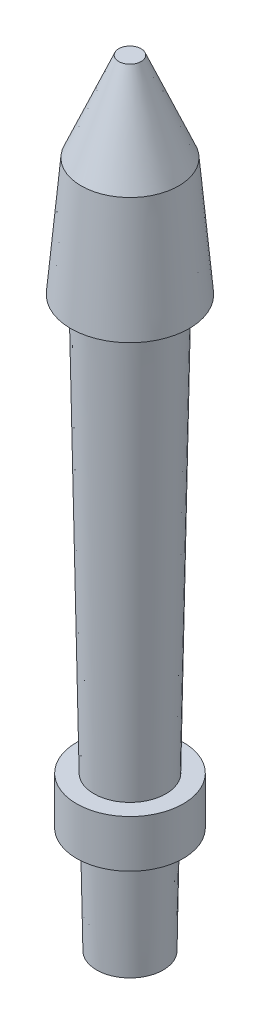
ISO-10303-21;
HEADER;
FILE_DESCRIPTION(('STEP AP214'),'2;1');
FILE_NAME('part.step','',(''),(''),'','','');
FILE_SCHEMA(('AUTOMOTIVE_DESIGN { 1 0 10303 214 1 1 1 1 }'));
ENDSEC;
DATA;
#1=APPLICATION_CONTEXT('core data for automotive mechanical design processes');
#2=APPLICATION_PROTOCOL_DEFINITION('international standard','automotive_design',2000,#1);
#3=PRODUCT_CONTEXT('',#1,'mechanical');
#4=PRODUCT('Part','Part','',(#3));
#5=PRODUCT_RELATED_PRODUCT_CATEGORY('part','',(#4));
#6=PRODUCT_DEFINITION_FORMATION('','',#4);
#7=PRODUCT_DEFINITION_CONTEXT('part definition',#1,'design');
#8=PRODUCT_DEFINITION('design','',#6,#7);
#9=PRODUCT_DEFINITION_SHAPE('','',#8);
#10=(LENGTH_UNIT() NAMED_UNIT(*) SI_UNIT(.MILLI.,.METRE.));
#11=(NAMED_UNIT(*) PLANE_ANGLE_UNIT() SI_UNIT($,.RADIAN.));
#12=(NAMED_UNIT(*) SI_UNIT($,.STERADIAN.) SOLID_ANGLE_UNIT());
#13=UNCERTAINTY_MEASURE_WITH_UNIT(LENGTH_MEASURE(1.E-05),#10,'distance_accuracy_value','');
#14=(GEOMETRIC_REPRESENTATION_CONTEXT(3) GLOBAL_UNCERTAINTY_ASSIGNED_CONTEXT((#13)) GLOBAL_UNIT_ASSIGNED_CONTEXT((#10,
#11,#12)) REPRESENTATION_CONTEXT('',''));
#15=CARTESIAN_POINT('',(0.,0.,0.));
#16=DIRECTION('',(0.,0.,1.));
#17=DIRECTION('',(1.,0.,0.));
#18=AXIS2_PLACEMENT_3D('',#15,#16,#17);
#19=CARTESIAN_POINT('',(0.,0.,0.));
#20=DIRECTION('',(0.,1.,0.));
#21=DIRECTION('',(0.,0.,1.));
#22=AXIS2_PLACEMENT_3D('',#19,#20,#21);
#23=CONICAL_SURFACE('',#22,6.075,0.0174532925199433);
#24=CARTESIAN_POINT('',(0.,-26.,0.));
#25=DIRECTION('',(0.,1.,0.));
#26=DIRECTION('',(0.,0.,1.));
#27=AXIS2_PLACEMENT_3D('',#24,#25,#26);
#28=CIRCLE('',#27,5.62116831186634);
#29=CARTESIAN_POINT('',(0.,-26.,5.62116831186634));
#30=VERTEX_POINT('',#29);
#31=EDGE_CURVE('E11',#30,#30,#28,.T.);
#32=ORIENTED_EDGE('',*,*,#31,.T.);
#33=EDGE_LOOP('',(#32));
#34=FACE_BOUND('',#33,.T.);
#35=CARTESIAN_POINT('',(0.,70.,0.));
#36=DIRECTION('',(0.,1.,0.));
#37=DIRECTION('',(0.,0.,1.));
#38=AXIS2_PLACEMENT_3D('',#35,#36,#37);
#39=CIRCLE('',#38,7.29685454497523);
#40=CARTESIAN_POINT('',(0.,70.,7.29685454497523));
#41=VERTEX_POINT('',#40);
#42=EDGE_CURVE('E55',#41,#41,#39,.T.);
#43=ORIENTED_EDGE('',*,*,#42,.F.);
#44=EDGE_LOOP('',(#43));
#45=FACE_BOUND('',#44,.T.);
#46=ADVANCED_FACE('F49',(#34,#45),#23,.T.);
#47=CARTESIAN_POINT('',(0.,-26.,0.));
#48=DIRECTION('',(0.,1.,0.));
#49=DIRECTION('',(0.,0.,1.));
#50=AXIS2_PLACEMENT_3D('',#47,#48,#49);
#51=PLANE('',#50);
#52=ORIENTED_EDGE('',*,*,#31,.F.);
#53=EDGE_LOOP('',(#52));
#54=FACE_BOUND('',#53,.T.);
#55=ADVANCED_FACE('F84',(#54),#51,.F.);
#56=CARTESIAN_POINT('',(0.,70.,0.));
#57=DIRECTION('',(0.,-1.,0.));
#58=DIRECTION('',(0.,0.,1.));
#59=AXIS2_PLACEMENT_3D('',#56,#57,#58);
#60=CONICAL_SURFACE('',#59,10.,0.0872664625997165);
#61=CARTESIAN_POINT('',(0.,90.,0.));
#62=DIRECTION('',(0.,1.,0.));
#63=DIRECTION('',(0.,0.,1.));
#64=AXIS2_PLACEMENT_3D('',#61,#62,#63);
#65=CIRCLE('',#64,8.25022672948152);
#66=CARTESIAN_POINT('',(0.,90.,8.25022672948152));
#67=VERTEX_POINT('',#66);
#68=EDGE_CURVE('E59',#67,#67,#65,.T.);
#69=ORIENTED_EDGE('',*,*,#68,.F.);
#70=EDGE_LOOP('',(#69));
#71=FACE_BOUND('',#70,.T.);
#72=CARTESIAN_POINT('',(0.,70.,0.));
#73=DIRECTION('',(0.,1.,0.));
#74=DIRECTION('',(0.,0.,1.));
#75=AXIS2_PLACEMENT_3D('',#72,#73,#74);
#76=CIRCLE('',#75,10.);
#77=CARTESIAN_POINT('',(0.,70.,10.));
#78=VERTEX_POINT('',#77);
#79=EDGE_CURVE('E63',#78,#78,#76,.T.);
#80=ORIENTED_EDGE('',*,*,#79,.T.);
#81=EDGE_LOOP('',(#80));
#82=FACE_BOUND('',#81,.T.);
#83=ADVANCED_FACE('F81',(#71,#82),#60,.T.);
#84=CARTESIAN_POINT('',(0.,70.,0.));
#85=DIRECTION('',(0.,1.,0.));
#86=DIRECTION('',(0.,0.,1.));
#87=AXIS2_PLACEMENT_3D('',#84,#85,#86);
#88=PLANE('',#87);
#89=ORIENTED_EDGE('',*,*,#42,.T.);
#90=EDGE_LOOP('',(#89));
#91=FACE_BOUND('',#90,.T.);
#92=ORIENTED_EDGE('',*,*,#79,.F.);
#93=EDGE_LOOP('',(#92));
#94=FACE_BOUND('',#93,.T.);
#95=ADVANCED_FACE('F77',(#91,#94),#88,.F.);
#96=CARTESIAN_POINT('',(0.,90.,0.));
#97=DIRECTION('',(0.,-1.,0.));
#98=DIRECTION('',(0.,0.,1.));
#99=AXIS2_PLACEMENT_3D('',#96,#97,#98);
#100=CONICAL_SURFACE('',#99,8.25022672948152,0.401425727958696);
#101=CARTESIAN_POINT('',(0.,105.,0.));
#102=DIRECTION('',(0.,1.,0.));
#103=DIRECTION('',(0.,0.,1.));
#104=AXIS2_PLACEMENT_3D('',#101,#102,#103);
#105=CIRCLE('',#104,1.88310448633745);
#106=CARTESIAN_POINT('',(0.,105.,1.88310448633745));
#107=VERTEX_POINT('',#106);
#108=EDGE_CURVE('E68',#107,#107,#105,.T.);
#109=CARTESIAN_POINT('',(0.,105.,1.88310448633745));
#110=CARTESIAN_POINT('',(0.,104.84375,1.9494286763702));
#111=CARTESIAN_POINT('',(0.,104.6875,2.01575286640295));
#112=CARTESIAN_POINT('',(0.,104.375,2.14840124646845));
#113=CARTESIAN_POINT('',(0.,104.21875,2.2147254365012));
#114=CARTESIAN_POINT('',(0.,103.90625,2.3473738165667));
#115=CARTESIAN_POINT('',(0.,103.75,2.41369800659945));
#116=CARTESIAN_POINT('',(0.,103.4375,2.54634638666496));
#117=CARTESIAN_POINT('',(0.,103.28125,2.61267057669771));
#118=CARTESIAN_POINT('',(0.,102.96875,2.74531895676321));
#119=CARTESIAN_POINT('',(0.,102.8125,2.81164314679596));
#120=CARTESIAN_POINT('',(0.,102.5,2.94429152686146));
#121=CARTESIAN_POINT('',(0.,102.34375,3.01061571689421));
#122=CARTESIAN_POINT('',(0.,102.03125,3.14326409695971));
#123=CARTESIAN_POINT('',(0.,101.875,3.20958828699246));
#124=CARTESIAN_POINT('',(0.,101.5625,3.34223666705796));
#125=CARTESIAN_POINT('',(0.,101.40625,3.40856085709072));
#126=CARTESIAN_POINT('',(0.,101.09375,3.54120923715622));
#127=CARTESIAN_POINT('',(0.,100.9375,3.60753342718897));
#128=CARTESIAN_POINT('',(0.,100.625,3.74018180725447));
#129=CARTESIAN_POINT('',(0.,100.46875,3.80650599728722));
#130=CARTESIAN_POINT('',(0.,100.15625,3.93915437735272));
#131=CARTESIAN_POINT('',(0.,100.,4.00547856738547));
#132=CARTESIAN_POINT('',(0.,99.6875,4.13812694745098));
#133=CARTESIAN_POINT('',(0.,99.53125,4.20445113748373));
#134=CARTESIAN_POINT('',(0.,99.21875,4.33709951754923));
#135=CARTESIAN_POINT('',(0.,99.0625,4.40342370758198));
#136=CARTESIAN_POINT('',(0.,98.75,4.53607208764748));
#137=CARTESIAN_POINT('',(0.,98.59375,4.60239627768023));
#138=CARTESIAN_POINT('',(0.,98.28125,4.73504465774573));
#139=CARTESIAN_POINT('',(0.,98.125,4.80136884777848));
#140=CARTESIAN_POINT('',(0.,97.8125,4.93401722784398));
#141=CARTESIAN_POINT('',(0.,97.65625,5.00034141787673));
#142=CARTESIAN_POINT('',(0.,97.34375,5.13298979794224));
#143=CARTESIAN_POINT('',(0.,97.1875,5.19931398797499));
#144=CARTESIAN_POINT('',(0.,96.875,5.33196236804049));
#145=CARTESIAN_POINT('',(0.,96.71875,5.39828655807324));
#146=CARTESIAN_POINT('',(0.,96.40625,5.53093493813874));
#147=CARTESIAN_POINT('',(0.,96.25,5.59725912817149));
#148=CARTESIAN_POINT('',(0.,95.9375,5.72990750823699));
#149=CARTESIAN_POINT('',(0.,95.78125,5.79623169826974));
#150=CARTESIAN_POINT('',(0.,95.46875,5.92888007833524));
#151=CARTESIAN_POINT('',(0.,95.3125,5.99520426836799));
#152=CARTESIAN_POINT('',(0.,95.,6.1278526484335));
#153=CARTESIAN_POINT('',(0.,94.84375,6.19417683846625));
#154=CARTESIAN_POINT('',(0.,94.53125,6.32682521853175));
#155=CARTESIAN_POINT('',(0.,94.375,6.3931494085645));
#156=CARTESIAN_POINT('',(0.,94.0625,6.52579778863));
#157=CARTESIAN_POINT('',(0.,93.90625,6.59212197866275));
#158=CARTESIAN_POINT('',(0.,93.59375,6.72477035872825));
#159=CARTESIAN_POINT('',(0.,93.4375,6.79109454876101));
#160=CARTESIAN_POINT('',(0.,93.125,6.92374292882651));
#161=CARTESIAN_POINT('',(0.,92.96875,6.99006711885926));
#162=CARTESIAN_POINT('',(0.,92.65625,7.12271549892476));
#163=CARTESIAN_POINT('',(0.,92.5,7.18903968895751));
#164=CARTESIAN_POINT('',(0.,92.1875,7.32168806902301));
#165=CARTESIAN_POINT('',(0.,92.03125,7.38801225905576));
#166=CARTESIAN_POINT('',(0.,91.71875,7.52066063912126));
#167=CARTESIAN_POINT('',(0.,91.5625,7.58698482915401));
#168=CARTESIAN_POINT('',(0.,91.25,7.71963320921952));
#169=CARTESIAN_POINT('',(0.,91.09375,7.78595739925227));
#170=CARTESIAN_POINT('',(0.,90.78125,7.91860577931777));
#171=CARTESIAN_POINT('',(0.,90.625,7.98492996935052));
#172=CARTESIAN_POINT('',(0.,90.3125,8.11757834941602));
#173=CARTESIAN_POINT('',(0.,90.15625,8.18390253944877));
#174=CARTESIAN_POINT('',(0.,90.,8.25022672948152));
#175=B_SPLINE_CURVE_WITH_KNOTS('',3,(#109,#110,#111,#112,#113,#114,#115,#116,#117,#118,#119,
#120,#121,#122,#123,#124,#125,#126,#127,#128,#129,#130,#131,#132,#133,#134,#135,#136,#137,#138,
#139,#140,#141,#142,#143,#144,#145,#146,#147,#148,#149,#150,#151,#152,#153,#154,#155,#156,#157,
#158,#159,#160,#161,#162,#163,#164,#165,#166,#167,#168,#169,#170,#171,#172,#173,#174),
.UNSPECIFIED.,.F.,.F.,(4,2,2,2,2,2,2,2,2,2,2,2,2,2,2,2,2,2,2,2,2,2,2,2,2,2,2,2,2,2,2,2,4),(0.,
0.509231426908736,1.01846285381747,1.52769428072621,2.03692570763493,2.54615713454367,
3.0553885614524,3.56461998836114,4.07385141526986,4.5830828421786,5.09231426908734,
5.60154569599606,6.1107771229048,6.62000854981353,7.12923997672226,7.63847140363099,
8.14770283053973,8.65693425744847,9.1661656843572,9.67539711126593,10.1846285381747,
10.6938599650834,11.2030913919921,11.7123228189009,12.2215542458096,12.7307856727183,
13.2400170996271,13.7492485265358,14.2584799534445,14.7677113803532,15.276942807262,
15.7861742341707,16.2954056610795),.UNSPECIFIED.);
#176=EDGE_CURVE('BSEAM74',#107,#67,#175,.T.);
#177=ORIENTED_EDGE('',*,*,#108,.F.);
#178=ORIENTED_EDGE('',*,*,#68,.T.);
#179=ORIENTED_EDGE('',*,*,#176,.T.);
#180=ORIENTED_EDGE('',*,*,#176,.F.);
#181=EDGE_LOOP('',(#177,#179,#178,#180));
#182=FACE_BOUND('',#181,.T.);
#183=ADVANCED_FACE('F74',(#182),#100,.T.);
#184=CARTESIAN_POINT('',(0.,105.,0.));
#185=DIRECTION('',(0.,1.,0.));
#186=DIRECTION('',(0.,0.,1.));
#187=AXIS2_PLACEMENT_3D('',#184,#185,#186);
#188=PLANE('',#187);
#189=ORIENTED_EDGE('',*,*,#108,.T.);
#190=EDGE_LOOP('',(#189));
#191=FACE_BOUND('',#190,.T.);
#192=ADVANCED_FACE('F72',(#191),#188,.T.);
#193=CLOSED_SHELL('',(#46,#55,#83,#95,#183,#192));
#194=MANIFOLD_SOLID_BREP('B2',#193);
#195=CARTESIAN_POINT('',(0.,-8.,0.));
#196=DIRECTION('',(0.,1.,0.));
#197=DIRECTION('',(0.,0.,1.));
#198=AXIS2_PLACEMENT_3D('',#195,#196,#197);
#199=CYLINDRICAL_SURFACE('',#198,9.);
#200=CARTESIAN_POINT('',(0.,-8.,0.));
#201=DIRECTION('',(0.,1.,0.));
#202=DIRECTION('',(0.,0.,1.));
#203=AXIS2_PLACEMENT_3D('',#200,#201,#202);
#204=CIRCLE('',#203,9.);
#205=CARTESIAN_POINT('',(0.,-8.,9.));
#206=VERTEX_POINT('',#205);
#207=EDGE_CURVE('E48',#206,#206,#204,.T.);
#208=ORIENTED_EDGE('',*,*,#207,.T.);
#209=EDGE_LOOP('',(#208));
#210=FACE_BOUND('',#209,.T.);
#211=CARTESIAN_POINT('',(0.,0.,0.));
#212=DIRECTION('',(0.,1.,0.));
#213=DIRECTION('',(0.,0.,1.));
#214=AXIS2_PLACEMENT_3D('',#211,#212,#213);
#215=CIRCLE('',#214,9.);
#216=CARTESIAN_POINT('',(0.,0.,9.));
#217=VERTEX_POINT('',#216);
#218=EDGE_CURVE('E167',#217,#217,#215,.T.);
#219=ORIENTED_EDGE('',*,*,#218,.F.);
#220=EDGE_LOOP('',(#219));
#221=FACE_BOUND('',#220,.T.);
#222=ADVANCED_FACE('F164',(#210,#221),#199,.T.);
#223=CARTESIAN_POINT('',(0.,-8.,0.));
#224=DIRECTION('',(0.,1.,0.));
#225=DIRECTION('',(0.,0.,1.));
#226=AXIS2_PLACEMENT_3D('',#223,#224,#225);
#227=PLANE('',#226);
#228=CARTESIAN_POINT('',(0.,-8.,0.));
#229=DIRECTION('',(0.,1.,0.));
#230=DIRECTION('',(0.,0.,1.));
#231=AXIS2_PLACEMENT_3D('',#228,#229,#230);
#232=CIRCLE('',#231,6.075);
#233=CARTESIAN_POINT('',(0.,-8.,6.075));
#234=VERTEX_POINT('',#233);
#235=EDGE_CURVE('E174',#234,#234,#232,.T.);
#236=ORIENTED_EDGE('',*,*,#235,.T.);
#237=EDGE_LOOP('',(#236));
#238=FACE_BOUND('',#237,.T.);
#239=ORIENTED_EDGE('',*,*,#207,.F.);
#240=EDGE_LOOP('',(#239));
#241=FACE_BOUND('',#240,.T.);
#242=ADVANCED_FACE('F182',(#238,#241),#227,.F.);
#243=CARTESIAN_POINT('',(0.,0.,0.));
#244=DIRECTION('',(0.,1.,0.));
#245=DIRECTION('',(0.,0.,1.));
#246=AXIS2_PLACEMENT_3D('',#243,#244,#245);
#247=PLANE('',#246);
#248=CARTESIAN_POINT('',(0.,0.,0.));
#249=DIRECTION('',(0.,1.,0.));
#250=DIRECTION('',(0.,0.,1.));
#251=AXIS2_PLACEMENT_3D('',#248,#249,#250);
#252=CIRCLE('',#251,6.075);
#253=CARTESIAN_POINT('',(0.,0.,6.075));
#254=VERTEX_POINT('',#253);
#255=EDGE_CURVE('E176',#254,#254,#252,.T.);
#256=ORIENTED_EDGE('',*,*,#255,.F.);
#257=EDGE_LOOP('',(#256));
#258=FACE_BOUND('',#257,.T.);
#259=ORIENTED_EDGE('',*,*,#218,.T.);
#260=EDGE_LOOP('',(#259));
#261=FACE_BOUND('',#260,.T.);
#262=ADVANCED_FACE('F188',(#258,#261),#247,.T.);
#263=CARTESIAN_POINT('',(0.,-8.,0.));
#264=DIRECTION('',(0.,1.,0.));
#265=DIRECTION('',(0.,0.,1.));
#266=AXIS2_PLACEMENT_3D('',#263,#264,#265);
#267=CYLINDRICAL_SURFACE('',#266,6.075);
#268=ORIENTED_EDGE('',*,*,#235,.F.);
#269=EDGE_LOOP('',(#268));
#270=FACE_BOUND('',#269,.T.);
#271=ORIENTED_EDGE('',*,*,#255,.T.);
#272=EDGE_LOOP('',(#271));
#273=FACE_BOUND('',#272,.T.);
#274=ADVANCED_FACE('F185',(#270,#273),#267,.F.);
#275=CLOSED_SHELL('',(#222,#242,#262,#274));
#276=MANIFOLD_SOLID_BREP('B6',#275);
#277=ADVANCED_BREP_SHAPE_REPRESENTATION('',(#18,#194,#276),#14);
#278=SHAPE_DEFINITION_REPRESENTATION(#9,#277);
ENDSEC;
END-ISO-10303-21;
